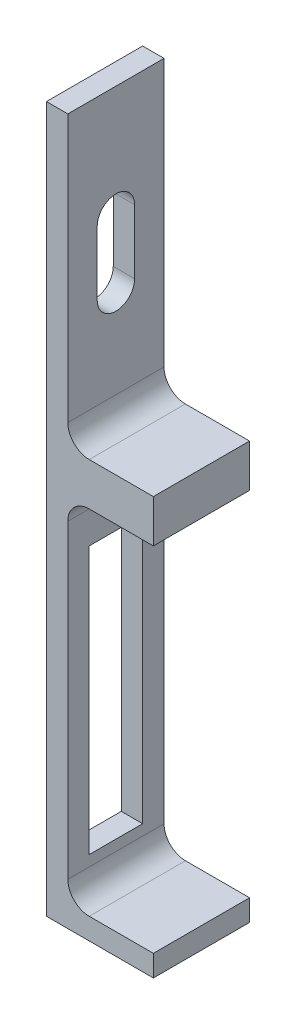
ISO-10303-21;
HEADER;
FILE_DESCRIPTION(('STEP AP214'),'2;1');
FILE_NAME('part.step','',(''),(''),'','','');
FILE_SCHEMA(('AUTOMOTIVE_DESIGN { 1 0 10303 214 1 1 1 1 }'));
ENDSEC;
DATA;
#1=APPLICATION_CONTEXT('core data for automotive mechanical design processes');
#2=APPLICATION_PROTOCOL_DEFINITION('international standard','automotive_design',2000,#1);
#3=PRODUCT_CONTEXT('',#1,'mechanical');
#4=PRODUCT('Part','Part','',(#3));
#5=PRODUCT_RELATED_PRODUCT_CATEGORY('part','',(#4));
#6=PRODUCT_DEFINITION_FORMATION('','',#4);
#7=PRODUCT_DEFINITION_CONTEXT('part definition',#1,'design');
#8=PRODUCT_DEFINITION('design','',#6,#7);
#9=PRODUCT_DEFINITION_SHAPE('','',#8);
#10=(LENGTH_UNIT() NAMED_UNIT(*) SI_UNIT(.MILLI.,.METRE.));
#11=(NAMED_UNIT(*) PLANE_ANGLE_UNIT() SI_UNIT($,.RADIAN.));
#12=(NAMED_UNIT(*) SI_UNIT($,.STERADIAN.) SOLID_ANGLE_UNIT());
#13=UNCERTAINTY_MEASURE_WITH_UNIT(LENGTH_MEASURE(1.E-05),#10,'distance_accuracy_value','');
#14=(GEOMETRIC_REPRESENTATION_CONTEXT(3) GLOBAL_UNCERTAINTY_ASSIGNED_CONTEXT((#13)) GLOBAL_UNIT_ASSIGNED_CONTEXT((#10,
#11,#12)) REPRESENTATION_CONTEXT('',''));
#15=CARTESIAN_POINT('',(0.,0.,0.));
#16=DIRECTION('',(0.,0.,1.));
#17=DIRECTION('',(1.,0.,0.));
#18=AXIS2_PLACEMENT_3D('',#15,#16,#17);
#19=CARTESIAN_POINT('',(2.,2.,9.));
#20=DIRECTION('',(-1.,0.,0.));
#21=DIRECTION('',(0.,0.,1.));
#22=AXIS2_PLACEMENT_3D('',#19,#20,#21);
#23=PLANE('',#22);
#24=DIRECTION('',(0.,1.,0.));
#25=VECTOR('',#24,1.);
#26=CARTESIAN_POINT('',(2.,2.,6.25000000000002));
#27=LINE('',#26,#25);
#28=CARTESIAN_POINT('',(2.,49.52,6.25000000000001));
#29=VERTEX_POINT('',#28);
#30=CARTESIAN_POINT('',(2.,55.52,6.25000000000001));
#31=VERTEX_POINT('',#30);
#32=EDGE_CURVE('E304',#29,#31,#27,.T.);
#33=ORIENTED_EDGE('',*,*,#32,.T.);
#34=CARTESIAN_POINT('',(2.,55.52,4.5));
#35=DIRECTION('',(-1.,0.,0.));
#36=DIRECTION('',(0.,0.,1.));
#37=AXIS2_PLACEMENT_3D('',#34,#35,#36);
#38=CIRCLE('',#37,1.75);
#39=CARTESIAN_POINT('',(2.,55.52,2.75));
#40=VERTEX_POINT('',#39);
#41=EDGE_CURVE('E307',#31,#40,#38,.T.);
#42=ORIENTED_EDGE('',*,*,#41,.T.);
#43=DIRECTION('',(0.,-1.,0.));
#44=VECTOR('',#43,1.);
#45=CARTESIAN_POINT('',(2.,2.,2.75000000000002));
#46=LINE('',#45,#44);
#47=CARTESIAN_POINT('',(2.,49.52,2.75));
#48=VERTEX_POINT('',#47);
#49=EDGE_CURVE('E298',#40,#48,#46,.T.);
#50=ORIENTED_EDGE('',*,*,#49,.T.);
#51=CARTESIAN_POINT('',(2.,49.52,4.50000000000001));
#52=DIRECTION('',(-1.,0.,0.));
#53=DIRECTION('',(0.,0.,1.));
#54=AXIS2_PLACEMENT_3D('',#51,#52,#53);
#55=CIRCLE('',#54,1.75);
#56=EDGE_CURVE('E301',#48,#29,#55,.T.);
#57=ORIENTED_EDGE('',*,*,#56,.T.);
#58=EDGE_LOOP('',(#33,#42,#50,#57));
#59=FACE_BOUND('',#58,.T.);
#60=DIRECTION('',(0.,1.,0.));
#61=VECTOR('',#60,1.);
#62=CARTESIAN_POINT('',(2.,2.,9.));
#63=LINE('',#62,#61);
#64=CARTESIAN_POINT('',(2.,41.,9.));
#65=VERTEX_POINT('',#64);
#66=CARTESIAN_POINT('',(2.,66.,9.));
#67=VERTEX_POINT('',#66);
#68=EDGE_CURVE('E264',#65,#67,#63,.T.);
#69=ORIENTED_EDGE('',*,*,#68,.F.);
#70=DIRECTION('',(0.,0.,1.));
#71=VECTOR('',#70,1.);
#72=CARTESIAN_POINT('',(2.,41.,9.));
#73=LINE('',#72,#71);
#74=CARTESIAN_POINT('',(2.,41.,0.));
#75=VERTEX_POINT('',#74);
#76=EDGE_CURVE('E322',#65,#75,#73,.F.);
#77=ORIENTED_EDGE('',*,*,#76,.T.);
#78=DIRECTION('',(0.,1.,0.));
#79=VECTOR('',#78,1.);
#80=CARTESIAN_POINT('',(2.,2.,0.));
#81=LINE('',#80,#79);
#82=CARTESIAN_POINT('',(2.,66.,0.));
#83=VERTEX_POINT('',#82);
#84=EDGE_CURVE('E279',#75,#83,#81,.T.);
#85=ORIENTED_EDGE('',*,*,#84,.T.);
#86=DIRECTION('',(0.,0.,-1.));
#87=VECTOR('',#86,1.);
#88=CARTESIAN_POINT('',(2.,66.,9.));
#89=LINE('',#88,#87);
#90=EDGE_CURVE('E286',#67,#83,#89,.T.);
#91=ORIENTED_EDGE('',*,*,#90,.F.);
#92=EDGE_LOOP('',(#69,#77,#85,#91));
#93=FACE_BOUND('',#92,.T.);
#94=ADVANCED_FACE('F36',(#59,#93),#23,.F.);
#95=CARTESIAN_POINT('',(0.,66.,9.));
#96=DIRECTION('',(1.,0.,0.));
#97=DIRECTION('',(0.,1.,0.));
#98=AXIS2_PLACEMENT_3D('',#95,#96,#97);
#99=PLANE('',#98);
#100=DIRECTION('',(0.,0.,1.));
#101=VECTOR('',#100,1.);
#102=CARTESIAN_POINT('',(0.,30.,7.));
#103=LINE('',#102,#101);
#104=CARTESIAN_POINT('',(0.,30.,2.00000000000001));
#105=VERTEX_POINT('',#104);
#106=CARTESIAN_POINT('',(0.,30.,7.));
#107=VERTEX_POINT('',#106);
#108=EDGE_CURVE('E210',#105,#107,#103,.T.);
#109=ORIENTED_EDGE('',*,*,#108,.T.);
#110=DIRECTION('',(0.,-1.,0.));
#111=VECTOR('',#110,1.);
#112=CARTESIAN_POINT('',(0.,5.,7.));
#113=LINE('',#112,#111);
#114=CARTESIAN_POINT('',(0.,5.,7.));
#115=VERTEX_POINT('',#114);
#116=EDGE_CURVE('E200',#107,#115,#113,.T.);
#117=ORIENTED_EDGE('',*,*,#116,.T.);
#118=DIRECTION('',(0.,0.,-1.));
#119=VECTOR('',#118,1.);
#120=CARTESIAN_POINT('',(0.,5.,7.));
#121=LINE('',#120,#119);
#122=CARTESIAN_POINT('',(0.,5.,2.00000000000001));
#123=VERTEX_POINT('',#122);
#124=EDGE_CURVE('E203',#115,#123,#121,.T.);
#125=ORIENTED_EDGE('',*,*,#124,.T.);
#126=DIRECTION('',(0.,1.,0.));
#127=VECTOR('',#126,1.);
#128=CARTESIAN_POINT('',(0.,5.,2.00000000000001));
#129=LINE('',#128,#127);
#130=EDGE_CURVE('E207',#123,#105,#129,.T.);
#131=ORIENTED_EDGE('',*,*,#130,.T.);
#132=EDGE_LOOP('',(#109,#117,#125,#131));
#133=FACE_BOUND('',#132,.T.);
#134=DIRECTION('',(0.,-1.,0.));
#135=VECTOR('',#134,1.);
#136=CARTESIAN_POINT('',(0.,55.52,2.75));
#137=LINE('',#136,#135);
#138=CARTESIAN_POINT('',(0.,55.52,2.75));
#139=VERTEX_POINT('',#138);
#140=CARTESIAN_POINT('',(0.,49.52,2.75));
#141=VERTEX_POINT('',#140);
#142=EDGE_CURVE('E235',#139,#141,#137,.T.);
#143=ORIENTED_EDGE('',*,*,#142,.F.);
#144=CARTESIAN_POINT('',(0.,55.52,4.5));
#145=DIRECTION('',(-1.,0.,0.));
#146=DIRECTION('',(0.,-1.,0.));
#147=AXIS2_PLACEMENT_3D('',#144,#145,#146);
#148=CIRCLE('',#147,1.75);
#149=CARTESIAN_POINT('',(0.,55.52,6.25000000000001));
#150=VERTEX_POINT('',#149);
#151=EDGE_CURVE('E227',#150,#139,#148,.T.);
#152=ORIENTED_EDGE('',*,*,#151,.F.);
#153=DIRECTION('',(0.,1.,0.));
#154=VECTOR('',#153,1.);
#155=CARTESIAN_POINT('',(0.,55.52,6.25000000000001));
#156=LINE('',#155,#154);
#157=CARTESIAN_POINT('',(0.,49.52,6.25000000000001));
#158=VERTEX_POINT('',#157);
#159=EDGE_CURVE('E241',#158,#150,#156,.T.);
#160=ORIENTED_EDGE('',*,*,#159,.F.);
#161=CARTESIAN_POINT('',(0.,49.52,4.50000000000001));
#162=DIRECTION('',(-1.,0.,0.));
#163=DIRECTION('',(0.,-1.,0.));
#164=AXIS2_PLACEMENT_3D('',#161,#162,#163);
#165=CIRCLE('',#164,1.75);
#166=EDGE_CURVE('E238',#141,#158,#165,.T.);
#167=ORIENTED_EDGE('',*,*,#166,.F.);
#168=EDGE_LOOP('',(#143,#152,#160,#167));
#169=FACE_BOUND('',#168,.T.);
#170=DIRECTION('',(0.,-1.,0.));
#171=VECTOR('',#170,1.);
#172=CARTESIAN_POINT('',(0.,66.,0.));
#173=LINE('',#172,#171);
#174=CARTESIAN_POINT('',(0.,66.,0.));
#175=VERTEX_POINT('',#174);
#176=CARTESIAN_POINT('',(0.,0.,0.));
#177=VERTEX_POINT('',#176);
#178=EDGE_CURVE('E247',#175,#177,#173,.T.);
#179=ORIENTED_EDGE('',*,*,#178,.T.);
#180=DIRECTION('',(0.,0.,-1.));
#181=VECTOR('',#180,1.);
#182=CARTESIAN_POINT('',(0.,0.,9.));
#183=LINE('',#182,#181);
#184=CARTESIAN_POINT('',(0.,0.,9.));
#185=VERTEX_POINT('',#184);
#186=EDGE_CURVE('E295',#185,#177,#183,.T.);
#187=ORIENTED_EDGE('',*,*,#186,.F.);
#188=DIRECTION('',(0.,-1.,0.));
#189=VECTOR('',#188,1.);
#190=CARTESIAN_POINT('',(0.,66.,9.));
#191=LINE('',#190,#189);
#192=CARTESIAN_POINT('',(0.,66.,9.));
#193=VERTEX_POINT('',#192);
#194=EDGE_CURVE('E254',#193,#185,#191,.T.);
#195=ORIENTED_EDGE('',*,*,#194,.F.);
#196=DIRECTION('',(0.,0.,-1.));
#197=VECTOR('',#196,1.);
#198=CARTESIAN_POINT('',(0.,66.,9.));
#199=LINE('',#198,#197);
#200=EDGE_CURVE('E269',#193,#175,#199,.T.);
#201=ORIENTED_EDGE('',*,*,#200,.T.);
#202=EDGE_LOOP('',(#179,#187,#195,#201));
#203=FACE_BOUND('',#202,.T.);
#204=ADVANCED_FACE('F357',(#133,#169,#203),#99,.F.);
#205=CARTESIAN_POINT('',(0.,0.,9.));
#206=DIRECTION('',(0.,1.,0.));
#207=DIRECTION('',(0.,0.,1.));
#208=AXIS2_PLACEMENT_3D('',#205,#206,#207);
#209=PLANE('',#208);
#210=DIRECTION('',(1.,0.,0.));
#211=VECTOR('',#210,1.);
#212=CARTESIAN_POINT('',(0.,0.,0.));
#213=LINE('',#212,#211);
#214=CARTESIAN_POINT('',(10.,0.,0.));
#215=VERTEX_POINT('',#214);
#216=EDGE_CURVE('E272',#177,#215,#213,.T.);
#217=ORIENTED_EDGE('',*,*,#216,.T.);
#218=DIRECTION('',(0.,0.,-1.));
#219=VECTOR('',#218,1.);
#220=CARTESIAN_POINT('',(10.,0.,9.));
#221=LINE('',#220,#219);
#222=CARTESIAN_POINT('',(10.,0.,9.));
#223=VERTEX_POINT('',#222);
#224=EDGE_CURVE('E292',#223,#215,#221,.T.);
#225=ORIENTED_EDGE('',*,*,#224,.F.);
#226=DIRECTION('',(1.,0.,0.));
#227=VECTOR('',#226,1.);
#228=CARTESIAN_POINT('',(0.,0.,9.));
#229=LINE('',#228,#227);
#230=EDGE_CURVE('E256',#185,#223,#229,.T.);
#231=ORIENTED_EDGE('',*,*,#230,.F.);
#232=ORIENTED_EDGE('',*,*,#186,.T.);
#233=EDGE_LOOP('',(#217,#225,#231,#232));
#234=FACE_BOUND('',#233,.T.);
#235=ADVANCED_FACE('F359',(#234),#209,.F.);
#236=CARTESIAN_POINT('',(10.,0.,9.));
#237=DIRECTION('',(-1.,0.,0.));
#238=DIRECTION('',(0.,0.,1.));
#239=AXIS2_PLACEMENT_3D('',#236,#237,#238);
#240=PLANE('',#239);
#241=DIRECTION('',(0.,1.,0.));
#242=VECTOR('',#241,1.);
#243=CARTESIAN_POINT('',(10.,0.,0.));
#244=LINE('',#243,#242);
#245=CARTESIAN_POINT('',(10.,2.,0.));
#246=VERTEX_POINT('',#245);
#247=EDGE_CURVE('E274',#215,#246,#244,.T.);
#248=ORIENTED_EDGE('',*,*,#247,.T.);
#249=DIRECTION('',(0.,0.,-1.));
#250=VECTOR('',#249,1.);
#251=CARTESIAN_POINT('',(10.,2.,9.));
#252=LINE('',#251,#250);
#253=CARTESIAN_POINT('',(10.,2.,9.));
#254=VERTEX_POINT('',#253);
#255=EDGE_CURVE('E289',#254,#246,#252,.T.);
#256=ORIENTED_EDGE('',*,*,#255,.F.);
#257=DIRECTION('',(0.,1.,0.));
#258=VECTOR('',#257,1.);
#259=CARTESIAN_POINT('',(10.,0.,9.));
#260=LINE('',#259,#258);
#261=EDGE_CURVE('E259',#223,#254,#260,.T.);
#262=ORIENTED_EDGE('',*,*,#261,.F.);
#263=ORIENTED_EDGE('',*,*,#224,.T.);
#264=EDGE_LOOP('',(#248,#256,#262,#263));
#265=FACE_BOUND('',#264,.T.);
#266=ADVANCED_FACE('F364',(#265),#240,.F.);
#267=CARTESIAN_POINT('',(10.,2.,9.));
#268=DIRECTION('',(0.,-1.,0.));
#269=DIRECTION('',(1.,0.,0.));
#270=AXIS2_PLACEMENT_3D('',#267,#268,#269);
#271=PLANE('',#270);
#272=DIRECTION('',(-1.,0.,0.));
#273=VECTOR('',#272,1.);
#274=CARTESIAN_POINT('',(10.,2.,0.));
#275=LINE('',#274,#273);
#276=CARTESIAN_POINT('',(4.,2.,0.));
#277=VERTEX_POINT('',#276);
#278=EDGE_CURVE('E276',#246,#277,#275,.T.);
#279=ORIENTED_EDGE('',*,*,#278,.T.);
#280=DIRECTION('',(0.,0.,-1.));
#281=VECTOR('',#280,1.);
#282=CARTESIAN_POINT('',(4.,2.,9.));
#283=LINE('',#282,#281);
#284=CARTESIAN_POINT('',(4.,2.,9.));
#285=VERTEX_POINT('',#284);
#286=EDGE_CURVE('E313',#277,#285,#283,.F.);
#287=ORIENTED_EDGE('',*,*,#286,.T.);
#288=DIRECTION('',(-1.,0.,0.));
#289=VECTOR('',#288,1.);
#290=CARTESIAN_POINT('',(10.,2.,9.));
#291=LINE('',#290,#289);
#292=EDGE_CURVE('E261',#254,#285,#291,.T.);
#293=ORIENTED_EDGE('',*,*,#292,.F.);
#294=ORIENTED_EDGE('',*,*,#255,.T.);
#295=EDGE_LOOP('',(#279,#287,#293,#294));
#296=FACE_BOUND('',#295,.T.);
#297=ADVANCED_FACE('F395',(#296),#271,.F.);
#298=DIRECTION('',(0.,0.,-1.));
#299=VECTOR('',#298,1.);
#300=CARTESIAN_POINT('',(2.,5.,7.));
#301=LINE('',#300,#299);
#302=CARTESIAN_POINT('',(2.,5.,7.));
#303=VERTEX_POINT('',#302);
#304=CARTESIAN_POINT('',(2.,5.,2.00000000000001));
#305=VERTEX_POINT('',#304);
#306=EDGE_CURVE('E216',#303,#305,#301,.T.);
#307=ORIENTED_EDGE('',*,*,#306,.F.);
#308=DIRECTION('',(0.,-1.,0.));
#309=VECTOR('',#308,1.);
#310=CARTESIAN_POINT('',(2.,5.,7.));
#311=LINE('',#310,#309);
#312=CARTESIAN_POINT('',(2.,30.,7.));
#313=VERTEX_POINT('',#312);
#314=EDGE_CURVE('E214',#313,#303,#311,.T.);
#315=ORIENTED_EDGE('',*,*,#314,.F.);
#316=DIRECTION('',(0.,0.,1.));
#317=VECTOR('',#316,1.);
#318=CARTESIAN_POINT('',(2.,30.,7.));
#319=LINE('',#318,#317);
#320=CARTESIAN_POINT('',(2.,30.,2.00000000000001));
#321=VERTEX_POINT('',#320);
#322=EDGE_CURVE('E204',#321,#313,#319,.T.);
#323=ORIENTED_EDGE('',*,*,#322,.F.);
#324=DIRECTION('',(0.,1.,0.));
#325=VECTOR('',#324,1.);
#326=CARTESIAN_POINT('',(2.,5.,2.00000000000001));
#327=LINE('',#326,#325);
#328=EDGE_CURVE('E220',#305,#321,#327,.T.);
#329=ORIENTED_EDGE('',*,*,#328,.F.);
#330=EDGE_LOOP('',(#307,#315,#323,#329));
#331=FACE_BOUND('',#330,.T.);
#332=CARTESIAN_POINT('',(2.,4.,0.));
#333=VERTEX_POINT('',#332);
#334=CARTESIAN_POINT('',(2.,33.,0.));
#335=VERTEX_POINT('',#334);
#336=EDGE_CURVE('E280',#333,#335,#81,.T.);
#337=ORIENTED_EDGE('',*,*,#336,.T.);
#338=DIRECTION('',(0.,0.,1.));
#339=VECTOR('',#338,1.);
#340=CARTESIAN_POINT('',(2.,33.,9.));
#341=LINE('',#340,#339);
#342=CARTESIAN_POINT('',(2.,33.,9.));
#343=VERTEX_POINT('',#342);
#344=EDGE_CURVE('E324',#335,#343,#341,.T.);
#345=ORIENTED_EDGE('',*,*,#344,.T.);
#346=CARTESIAN_POINT('',(2.,4.,9.));
#347=VERTEX_POINT('',#346);
#348=EDGE_CURVE('E265',#347,#343,#63,.T.);
#349=ORIENTED_EDGE('',*,*,#348,.F.);
#350=DIRECTION('',(0.,0.,-1.));
#351=VECTOR('',#350,1.);
#352=CARTESIAN_POINT('',(2.,4.,0.));
#353=LINE('',#352,#351);
#354=EDGE_CURVE('E310',#347,#333,#353,.T.);
#355=ORIENTED_EDGE('',*,*,#354,.T.);
#356=EDGE_LOOP('',(#337,#345,#349,#355));
#357=FACE_BOUND('',#356,.T.);
#358=ADVANCED_FACE('F375',(#331,#357),#23,.F.);
#359=CARTESIAN_POINT('',(2.,66.,9.));
#360=DIRECTION('',(0.,-1.,0.));
#361=DIRECTION('',(0.,0.,-1.));
#362=AXIS2_PLACEMENT_3D('',#359,#360,#361);
#363=PLANE('',#362);
#364=DIRECTION('',(-1.,0.,0.));
#365=VECTOR('',#364,1.);
#366=CARTESIAN_POINT('',(2.,66.,0.));
#367=LINE('',#366,#365);
#368=EDGE_CURVE('E257',#83,#175,#367,.T.);
#369=ORIENTED_EDGE('',*,*,#368,.T.);
#370=ORIENTED_EDGE('',*,*,#200,.F.);
#371=DIRECTION('',(-1.,0.,0.));
#372=VECTOR('',#371,1.);
#373=CARTESIAN_POINT('',(2.,66.,9.));
#374=LINE('',#373,#372);
#375=EDGE_CURVE('E267',#67,#193,#374,.T.);
#376=ORIENTED_EDGE('',*,*,#375,.F.);
#377=ORIENTED_EDGE('',*,*,#90,.T.);
#378=EDGE_LOOP('',(#369,#370,#376,#377));
#379=FACE_BOUND('',#378,.T.);
#380=ADVANCED_FACE('F352',(#379),#363,.F.);
#381=CARTESIAN_POINT('',(0.,0.,9.));
#382=DIRECTION('',(0.,0.,1.));
#383=DIRECTION('',(1.,0.,0.));
#384=AXIS2_PLACEMENT_3D('',#381,#382,#383);
#385=PLANE('',#384);
#386=ORIENTED_EDGE('',*,*,#194,.T.);
#387=ORIENTED_EDGE('',*,*,#230,.T.);
#388=ORIENTED_EDGE('',*,*,#261,.T.);
#389=ORIENTED_EDGE('',*,*,#292,.T.);
#390=CARTESIAN_POINT('',(4.,4.,9.));
#391=DIRECTION('',(0.,0.,1.));
#392=DIRECTION('',(1.,0.,0.));
#393=AXIS2_PLACEMENT_3D('',#390,#391,#392);
#394=CIRCLE('',#393,2.);
#395=EDGE_CURVE('E317',#285,#347,#394,.F.);
#396=ORIENTED_EDGE('',*,*,#395,.T.);
#397=ORIENTED_EDGE('',*,*,#348,.T.);
#398=CARTESIAN_POINT('',(4.,33.,9.));
#399=DIRECTION('',(0.,0.,1.));
#400=DIRECTION('',(1.,0.,0.));
#401=AXIS2_PLACEMENT_3D('',#398,#399,#400);
#402=CIRCLE('',#401,2.);
#403=CARTESIAN_POINT('',(4.,35.,9.));
#404=VERTEX_POINT('',#403);
#405=EDGE_CURVE('E44',#343,#404,#402,.F.);
#406=ORIENTED_EDGE('',*,*,#405,.T.);
#407=DIRECTION('',(1.,0.,0.));
#408=VECTOR('',#407,1.);
#409=CARTESIAN_POINT('',(2.,35.,9.));
#410=LINE('',#409,#408);
#411=CARTESIAN_POINT('',(10.,35.,9.));
#412=VERTEX_POINT('',#411);
#413=EDGE_CURVE('E176',#404,#412,#410,.T.);
#414=ORIENTED_EDGE('',*,*,#413,.T.);
#415=DIRECTION('',(0.,1.,0.));
#416=VECTOR('',#415,1.);
#417=CARTESIAN_POINT('',(10.,39.,9.));
#418=LINE('',#417,#416);
#419=CARTESIAN_POINT('',(10.,39.,9.));
#420=VERTEX_POINT('',#419);
#421=EDGE_CURVE('E182',#412,#420,#418,.T.);
#422=ORIENTED_EDGE('',*,*,#421,.T.);
#423=DIRECTION('',(-1.,0.,0.));
#424=VECTOR('',#423,1.);
#425=CARTESIAN_POINT('',(2.,39.,9.));
#426=LINE('',#425,#424);
#427=CARTESIAN_POINT('',(4.,39.,9.));
#428=VERTEX_POINT('',#427);
#429=EDGE_CURVE('E183',#420,#428,#426,.T.);
#430=ORIENTED_EDGE('',*,*,#429,.T.);
#431=CARTESIAN_POINT('',(4.,41.,9.));
#432=DIRECTION('',(0.,0.,1.));
#433=DIRECTION('',(1.,0.,0.));
#434=AXIS2_PLACEMENT_3D('',#431,#432,#433);
#435=CIRCLE('',#434,2.);
#436=EDGE_CURVE('E328',#428,#65,#435,.F.);
#437=ORIENTED_EDGE('',*,*,#436,.T.);
#438=ORIENTED_EDGE('',*,*,#68,.T.);
#439=ORIENTED_EDGE('',*,*,#375,.T.);
#440=EDGE_LOOP('',(#386,#387,#388,#389,#396,#397,#406,#414,#422,#430,#437,#438,#439));
#441=FACE_BOUND('',#440,.T.);
#442=ADVANCED_FACE('F179',(#441),#385,.T.);
#443=CARTESIAN_POINT('',(0.,0.,0.));
#444=DIRECTION('',(0.,0.,1.));
#445=DIRECTION('',(1.,0.,0.));
#446=AXIS2_PLACEMENT_3D('',#443,#444,#445);
#447=PLANE('',#446);
#448=ORIENTED_EDGE('',*,*,#178,.F.);
#449=ORIENTED_EDGE('',*,*,#368,.F.);
#450=ORIENTED_EDGE('',*,*,#84,.F.);
#451=CARTESIAN_POINT('',(4.,41.,0.));
#452=DIRECTION('',(0.,0.,1.));
#453=DIRECTION('',(1.,0.,0.));
#454=AXIS2_PLACEMENT_3D('',#451,#452,#453);
#455=CIRCLE('',#454,2.);
#456=CARTESIAN_POINT('',(4.,39.,0.));
#457=VERTEX_POINT('',#456);
#458=EDGE_CURVE('E330',#75,#457,#455,.T.);
#459=ORIENTED_EDGE('',*,*,#458,.T.);
#460=DIRECTION('',(1.,0.,0.));
#461=VECTOR('',#460,1.);
#462=CARTESIAN_POINT('',(2.,39.,0.));
#463=LINE('',#462,#461);
#464=CARTESIAN_POINT('',(10.,39.,0.));
#465=VERTEX_POINT('',#464);
#466=EDGE_CURVE('E217',#457,#465,#463,.T.);
#467=ORIENTED_EDGE('',*,*,#466,.T.);
#468=DIRECTION('',(0.,-1.,0.));
#469=VECTOR('',#468,1.);
#470=CARTESIAN_POINT('',(10.,39.,0.));
#471=LINE('',#470,#469);
#472=CARTESIAN_POINT('',(10.,35.,0.));
#473=VERTEX_POINT('',#472);
#474=EDGE_CURVE('E343',#465,#473,#471,.T.);
#475=ORIENTED_EDGE('',*,*,#474,.T.);
#476=DIRECTION('',(-1.,0.,0.));
#477=VECTOR('',#476,1.);
#478=CARTESIAN_POINT('',(2.,35.,0.));
#479=LINE('',#478,#477);
#480=CARTESIAN_POINT('',(4.,35.,0.));
#481=VERTEX_POINT('',#480);
#482=EDGE_CURVE('E188',#473,#481,#479,.T.);
#483=ORIENTED_EDGE('',*,*,#482,.T.);
#484=CARTESIAN_POINT('',(4.,33.,0.));
#485=DIRECTION('',(0.,0.,1.));
#486=DIRECTION('',(1.,0.,0.));
#487=AXIS2_PLACEMENT_3D('',#484,#485,#486);
#488=CIRCLE('',#487,2.);
#489=EDGE_CURVE('E11',#481,#335,#488,.T.);
#490=ORIENTED_EDGE('',*,*,#489,.T.);
#491=ORIENTED_EDGE('',*,*,#336,.F.);
#492=CARTESIAN_POINT('',(4.,4.,0.));
#493=DIRECTION('',(0.,0.,1.));
#494=DIRECTION('',(1.,0.,0.));
#495=AXIS2_PLACEMENT_3D('',#492,#493,#494);
#496=CIRCLE('',#495,2.);
#497=EDGE_CURVE('E315',#333,#277,#496,.T.);
#498=ORIENTED_EDGE('',*,*,#497,.T.);
#499=ORIENTED_EDGE('',*,*,#278,.F.);
#500=ORIENTED_EDGE('',*,*,#247,.F.);
#501=ORIENTED_EDGE('',*,*,#216,.F.);
#502=EDGE_LOOP('',(#448,#449,#450,#459,#467,#475,#483,#490,#491,#498,#499,#500,#501));
#503=FACE_BOUND('',#502,.T.);
#504=ADVANCED_FACE('F336',(#503),#447,.F.);
#505=CARTESIAN_POINT('',(10.,55.52,4.5));
#506=DIRECTION('',(-1.,0.,0.));
#507=DIRECTION('',(0.,-1.,0.));
#508=AXIS2_PLACEMENT_3D('',#505,#506,#507);
#509=CYLINDRICAL_SURFACE('',#508,1.75);
#510=DIRECTION('',(-1.,0.,0.));
#511=VECTOR('',#510,1.);
#512=CARTESIAN_POINT('',(10.,55.52,6.25000000000001));
#513=LINE('',#512,#511);
#514=EDGE_CURVE('E245',#31,#150,#513,.T.);
#515=ORIENTED_EDGE('',*,*,#514,.T.);
#516=ORIENTED_EDGE('',*,*,#151,.T.);
#517=DIRECTION('',(-1.,0.,0.));
#518=VECTOR('',#517,1.);
#519=CARTESIAN_POINT('',(10.,55.52,2.75));
#520=LINE('',#519,#518);
#521=EDGE_CURVE('E244',#40,#139,#520,.T.);
#522=ORIENTED_EDGE('',*,*,#521,.F.);
#523=ORIENTED_EDGE('',*,*,#41,.F.);
#524=EDGE_LOOP('',(#515,#516,#522,#523));
#525=FACE_BOUND('',#524,.T.);
#526=ADVANCED_FACE('F427',(#525),#509,.F.);
#527=CARTESIAN_POINT('',(10.,55.52,6.25000000000001));
#528=DIRECTION('',(0.,0.,1.));
#529=DIRECTION('',(0.,-1.,0.));
#530=AXIS2_PLACEMENT_3D('',#527,#528,#529);
#531=PLANE('',#530);
#532=DIRECTION('',(-1.,0.,0.));
#533=VECTOR('',#532,1.);
#534=CARTESIAN_POINT('',(10.,49.52,6.25000000000001));
#535=LINE('',#534,#533);
#536=EDGE_CURVE('E248',#29,#158,#535,.T.);
#537=ORIENTED_EDGE('',*,*,#536,.T.);
#538=ORIENTED_EDGE('',*,*,#159,.T.);
#539=ORIENTED_EDGE('',*,*,#514,.F.);
#540=ORIENTED_EDGE('',*,*,#32,.F.);
#541=EDGE_LOOP('',(#537,#538,#539,#540));
#542=FACE_BOUND('',#541,.T.);
#543=ADVANCED_FACE('F431',(#542),#531,.F.);
#544=CARTESIAN_POINT('',(10.,49.52,4.50000000000001));
#545=DIRECTION('',(-1.,0.,0.));
#546=DIRECTION('',(0.,-1.,0.));
#547=AXIS2_PLACEMENT_3D('',#544,#545,#546);
#548=CYLINDRICAL_SURFACE('',#547,1.75);
#549=DIRECTION('',(-1.,0.,0.));
#550=VECTOR('',#549,1.);
#551=CARTESIAN_POINT('',(10.,49.52,2.75));
#552=LINE('',#551,#550);
#553=EDGE_CURVE('E250',#48,#141,#552,.T.);
#554=ORIENTED_EDGE('',*,*,#553,.T.);
#555=ORIENTED_EDGE('',*,*,#166,.T.);
#556=ORIENTED_EDGE('',*,*,#536,.F.);
#557=ORIENTED_EDGE('',*,*,#56,.F.);
#558=EDGE_LOOP('',(#554,#555,#556,#557));
#559=FACE_BOUND('',#558,.T.);
#560=ADVANCED_FACE('F433',(#559),#548,.F.);
#561=CARTESIAN_POINT('',(10.,55.52,2.75));
#562=DIRECTION('',(0.,0.,-1.));
#563=DIRECTION('',(0.,1.,0.));
#564=AXIS2_PLACEMENT_3D('',#561,#562,#563);
#565=PLANE('',#564);
#566=ORIENTED_EDGE('',*,*,#521,.T.);
#567=ORIENTED_EDGE('',*,*,#142,.T.);
#568=ORIENTED_EDGE('',*,*,#553,.F.);
#569=ORIENTED_EDGE('',*,*,#49,.F.);
#570=EDGE_LOOP('',(#566,#567,#568,#569));
#571=FACE_BOUND('',#570,.T.);
#572=ADVANCED_FACE('F423',(#571),#565,.F.);
#573=CARTESIAN_POINT('',(0.,5.,7.));
#574=DIRECTION('',(0.,0.,1.));
#575=DIRECTION('',(0.,-1.,0.));
#576=AXIS2_PLACEMENT_3D('',#573,#574,#575);
#577=PLANE('',#576);
#578=ORIENTED_EDGE('',*,*,#314,.T.);
#579=DIRECTION('',(1.,0.,0.));
#580=VECTOR('',#579,1.);
#581=CARTESIAN_POINT('',(0.,5.,7.));
#582=LINE('',#581,#580);
#583=EDGE_CURVE('E213',#115,#303,#582,.T.);
#584=ORIENTED_EDGE('',*,*,#583,.F.);
#585=ORIENTED_EDGE('',*,*,#116,.F.);
#586=DIRECTION('',(1.,0.,0.));
#587=VECTOR('',#586,1.);
#588=CARTESIAN_POINT('',(0.,30.,7.));
#589=LINE('',#588,#587);
#590=EDGE_CURVE('E225',#107,#313,#589,.T.);
#591=ORIENTED_EDGE('',*,*,#590,.T.);
#592=EDGE_LOOP('',(#578,#584,#585,#591));
#593=FACE_BOUND('',#592,.T.);
#594=ADVANCED_FACE('F411',(#593),#577,.F.);
#595=CARTESIAN_POINT('',(0.,30.,7.));
#596=DIRECTION('',(0.,1.,0.));
#597=DIRECTION('',(0.,0.,1.));
#598=AXIS2_PLACEMENT_3D('',#595,#596,#597);
#599=PLANE('',#598);
#600=ORIENTED_EDGE('',*,*,#322,.T.);
#601=ORIENTED_EDGE('',*,*,#590,.F.);
#602=ORIENTED_EDGE('',*,*,#108,.F.);
#603=DIRECTION('',(1.,0.,0.));
#604=VECTOR('',#603,1.);
#605=CARTESIAN_POINT('',(0.,30.,2.00000000000001));
#606=LINE('',#605,#604);
#607=EDGE_CURVE('E228',#105,#321,#606,.T.);
#608=ORIENTED_EDGE('',*,*,#607,.T.);
#609=EDGE_LOOP('',(#600,#601,#602,#608));
#610=FACE_BOUND('',#609,.T.);
#611=ADVANCED_FACE('F414',(#610),#599,.F.);
#612=CARTESIAN_POINT('',(0.,5.,2.00000000000001));
#613=DIRECTION('',(0.,0.,-1.));
#614=DIRECTION('',(0.,1.,0.));
#615=AXIS2_PLACEMENT_3D('',#612,#613,#614);
#616=PLANE('',#615);
#617=ORIENTED_EDGE('',*,*,#328,.T.);
#618=ORIENTED_EDGE('',*,*,#607,.F.);
#619=ORIENTED_EDGE('',*,*,#130,.F.);
#620=DIRECTION('',(1.,0.,0.));
#621=VECTOR('',#620,1.);
#622=CARTESIAN_POINT('',(0.,5.,2.00000000000001));
#623=LINE('',#622,#621);
#624=EDGE_CURVE('E230',#123,#305,#623,.T.);
#625=ORIENTED_EDGE('',*,*,#624,.T.);
#626=EDGE_LOOP('',(#617,#618,#619,#625));
#627=FACE_BOUND('',#626,.T.);
#628=ADVANCED_FACE('F416',(#627),#616,.F.);
#629=CARTESIAN_POINT('',(0.,5.,7.));
#630=DIRECTION('',(0.,-1.,0.));
#631=DIRECTION('',(0.,0.,-1.));
#632=AXIS2_PLACEMENT_3D('',#629,#630,#631);
#633=PLANE('',#632);
#634=ORIENTED_EDGE('',*,*,#306,.T.);
#635=ORIENTED_EDGE('',*,*,#624,.F.);
#636=ORIENTED_EDGE('',*,*,#124,.F.);
#637=ORIENTED_EDGE('',*,*,#583,.T.);
#638=EDGE_LOOP('',(#634,#635,#636,#637));
#639=FACE_BOUND('',#638,.T.);
#640=ADVANCED_FACE('F407',(#639),#633,.F.);
#641=CARTESIAN_POINT('',(4.,4.,9.));
#642=DIRECTION('',(0.,0.,1.));
#643=DIRECTION('',(1.,0.,0.));
#644=AXIS2_PLACEMENT_3D('',#641,#642,#643);
#645=CYLINDRICAL_SURFACE('',#644,2.);
#646=ORIENTED_EDGE('',*,*,#395,.F.);
#647=ORIENTED_EDGE('',*,*,#286,.F.);
#648=ORIENTED_EDGE('',*,*,#497,.F.);
#649=ORIENTED_EDGE('',*,*,#354,.F.);
#650=EDGE_LOOP('',(#646,#647,#648,#649));
#651=FACE_BOUND('',#650,.T.);
#652=ADVANCED_FACE('F372',(#651),#645,.F.);
#653=CARTESIAN_POINT('',(2.,39.,-8.94427190999916));
#654=DIRECTION('',(0.,1.,0.));
#655=DIRECTION('',(0.,0.,1.));
#656=AXIS2_PLACEMENT_3D('',#653,#654,#655);
#657=PLANE('',#656);
#658=ORIENTED_EDGE('',*,*,#466,.F.);
#659=DIRECTION('',(0.,0.,1.));
#660=VECTOR('',#659,1.);
#661=CARTESIAN_POINT('',(4.,39.,-8.94427190999916));
#662=LINE('',#661,#660);
#663=EDGE_CURVE('E319',#457,#428,#662,.T.);
#664=ORIENTED_EDGE('',*,*,#663,.T.);
#665=ORIENTED_EDGE('',*,*,#429,.F.);
#666=DIRECTION('',(0.,0.,1.));
#667=VECTOR('',#666,1.);
#668=CARTESIAN_POINT('',(10.,39.,-8.94427190999916));
#669=LINE('',#668,#667);
#670=EDGE_CURVE('E191',#465,#420,#669,.T.);
#671=ORIENTED_EDGE('',*,*,#670,.F.);
#672=EDGE_LOOP('',(#658,#664,#665,#671));
#673=FACE_BOUND('',#672,.T.);
#674=ADVANCED_FACE('F342',(#673),#657,.T.);
#675=CARTESIAN_POINT('',(10.,39.,-8.94427190999916));
#676=DIRECTION('',(1.,0.,0.));
#677=DIRECTION('',(0.,0.,-1.));
#678=AXIS2_PLACEMENT_3D('',#675,#676,#677);
#679=PLANE('',#678);
#680=ORIENTED_EDGE('',*,*,#474,.F.);
#681=ORIENTED_EDGE('',*,*,#670,.T.);
#682=ORIENTED_EDGE('',*,*,#421,.F.);
#683=DIRECTION('',(0.,0.,1.));
#684=VECTOR('',#683,1.);
#685=CARTESIAN_POINT('',(10.,35.,-8.94427190999916));
#686=LINE('',#685,#684);
#687=EDGE_CURVE('E186',#473,#412,#686,.T.);
#688=ORIENTED_EDGE('',*,*,#687,.F.);
#689=EDGE_LOOP('',(#680,#681,#682,#688));
#690=FACE_BOUND('',#689,.T.);
#691=ADVANCED_FACE('F193',(#690),#679,.T.);
#692=CARTESIAN_POINT('',(2.,35.,-8.94427190999916));
#693=DIRECTION('',(0.,-1.,0.));
#694=DIRECTION('',(0.,0.,-1.));
#695=AXIS2_PLACEMENT_3D('',#692,#693,#694);
#696=PLANE('',#695);
#697=ORIENTED_EDGE('',*,*,#413,.F.);
#698=DIRECTION('',(0.,0.,1.));
#699=VECTOR('',#698,1.);
#700=CARTESIAN_POINT('',(4.,35.,-8.94427190999916));
#701=LINE('',#700,#699);
#702=EDGE_CURVE('E57',#404,#481,#701,.F.);
#703=ORIENTED_EDGE('',*,*,#702,.T.);
#704=ORIENTED_EDGE('',*,*,#482,.F.);
#705=ORIENTED_EDGE('',*,*,#687,.T.);
#706=EDGE_LOOP('',(#697,#703,#704,#705));
#707=FACE_BOUND('',#706,.T.);
#708=ADVANCED_FACE('F187',(#707),#696,.T.);
#709=CARTESIAN_POINT('',(4.,41.,-8.94427190999916));
#710=DIRECTION('',(0.,0.,1.));
#711=DIRECTION('',(1.,0.,0.));
#712=AXIS2_PLACEMENT_3D('',#709,#710,#711);
#713=CYLINDRICAL_SURFACE('',#712,2.);
#714=ORIENTED_EDGE('',*,*,#458,.F.);
#715=ORIENTED_EDGE('',*,*,#76,.F.);
#716=ORIENTED_EDGE('',*,*,#436,.F.);
#717=ORIENTED_EDGE('',*,*,#663,.F.);
#718=EDGE_LOOP('',(#714,#715,#716,#717));
#719=FACE_BOUND('',#718,.T.);
#720=ADVANCED_FACE('F345',(#719),#713,.F.);
#721=CARTESIAN_POINT('',(4.,33.,9.));
#722=DIRECTION('',(0.,0.,1.));
#723=DIRECTION('',(1.,0.,0.));
#724=AXIS2_PLACEMENT_3D('',#721,#722,#723);
#725=CYLINDRICAL_SURFACE('',#724,2.);
#726=ORIENTED_EDGE('',*,*,#489,.F.);
#727=ORIENTED_EDGE('',*,*,#702,.F.);
#728=ORIENTED_EDGE('',*,*,#405,.F.);
#729=ORIENTED_EDGE('',*,*,#344,.F.);
#730=EDGE_LOOP('',(#726,#727,#728,#729));
#731=FACE_BOUND('',#730,.T.);
#732=ADVANCED_FACE('F38',(#731),#725,.F.);
#733=CLOSED_SHELL('',(#94,#204,#235,#266,#297,#358,#380,#442,#504,#526,#543,#560,#572,#594,#611,
#628,#640,#652,#674,#691,#708,#720,#732));
#734=MANIFOLD_SOLID_BREP('B2',#733);
#735=ADVANCED_BREP_SHAPE_REPRESENTATION('',(#18,#734),#14);
#736=SHAPE_DEFINITION_REPRESENTATION(#9,#735);
ENDSEC;
END-ISO-10303-21;
